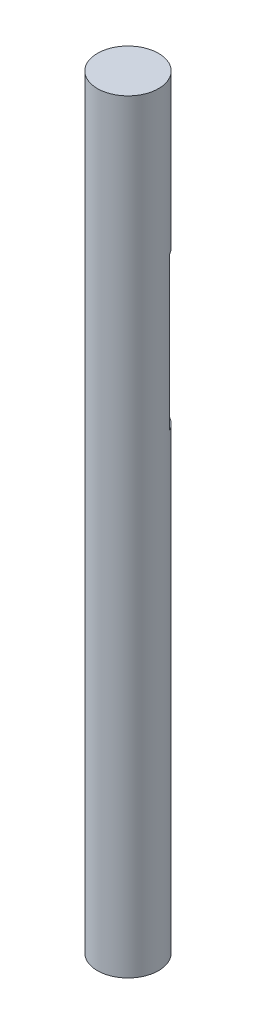
ISO-10303-21;
HEADER;
FILE_DESCRIPTION(('STEP AP214'),'2;1');
FILE_NAME('part.step','',(''),(''),'','','');
FILE_SCHEMA(('AUTOMOTIVE_DESIGN { 1 0 10303 214 1 1 1 1 }'));
ENDSEC;
DATA;
#1=APPLICATION_CONTEXT('core data for automotive mechanical design processes');
#2=APPLICATION_PROTOCOL_DEFINITION('international standard','automotive_design',2000,#1);
#3=PRODUCT_CONTEXT('',#1,'mechanical');
#4=PRODUCT('Part','Part','',(#3));
#5=PRODUCT_RELATED_PRODUCT_CATEGORY('part','',(#4));
#6=PRODUCT_DEFINITION_FORMATION('','',#4);
#7=PRODUCT_DEFINITION_CONTEXT('part definition',#1,'design');
#8=PRODUCT_DEFINITION('design','',#6,#7);
#9=PRODUCT_DEFINITION_SHAPE('','',#8);
#10=(LENGTH_UNIT() NAMED_UNIT(*) SI_UNIT(.MILLI.,.METRE.));
#11=(NAMED_UNIT(*) PLANE_ANGLE_UNIT() SI_UNIT($,.RADIAN.));
#12=(NAMED_UNIT(*) SI_UNIT($,.STERADIAN.) SOLID_ANGLE_UNIT());
#13=UNCERTAINTY_MEASURE_WITH_UNIT(LENGTH_MEASURE(1.E-05),#10,'distance_accuracy_value','');
#14=(GEOMETRIC_REPRESENTATION_CONTEXT(3) GLOBAL_UNCERTAINTY_ASSIGNED_CONTEXT((#13)) GLOBAL_UNIT_ASSIGNED_CONTEXT((#10,
#11,#12)) REPRESENTATION_CONTEXT('',''));
#15=CARTESIAN_POINT('',(0.,0.,0.));
#16=DIRECTION('',(0.,0.,1.));
#17=DIRECTION('',(1.,0.,0.));
#18=AXIS2_PLACEMENT_3D('',#15,#16,#17);
#19=CARTESIAN_POINT('',(0.,100.,0.));
#20=DIRECTION('',(0.,-1.,0.));
#21=DIRECTION('',(0.,0.,-1.));
#22=AXIS2_PLACEMENT_3D('',#19,#20,#21);
#23=CYLINDRICAL_SURFACE('',#22,4.);
#24=DIRECTION('',(0.,1.,0.));
#25=VECTOR('',#24,1.);
#26=CARTESIAN_POINT('',(-3.46410161513775,60.,-2.));
#27=LINE('',#26,#25);
#28=CARTESIAN_POINT('',(-3.46410161513775,60.,-2.));
#29=VERTEX_POINT('',#28);
#30=CARTESIAN_POINT('',(-3.46410161513775,80.,-2.));
#31=VERTEX_POINT('',#30);
#32=EDGE_CURVE('E72',#29,#31,#27,.T.);
#33=ORIENTED_EDGE('',*,*,#32,.F.);
#34=CARTESIAN_POINT('',(0.,60.,0.));
#35=DIRECTION('',(0.,-1.,0.));
#36=DIRECTION('',(0.,0.,-1.));
#37=AXIS2_PLACEMENT_3D('',#34,#35,#36);
#38=CIRCLE('',#37,4.);
#39=CARTESIAN_POINT('',(3.46410161513775,60.,-2.));
#40=VERTEX_POINT('',#39);
#41=EDGE_CURVE('E11',#29,#40,#38,.T.);
#42=ORIENTED_EDGE('',*,*,#41,.T.);
#43=DIRECTION('',(0.,1.,0.));
#44=VECTOR('',#43,1.);
#45=CARTESIAN_POINT('',(3.46410161513775,60.,-2.));
#46=LINE('',#45,#44);
#47=CARTESIAN_POINT('',(3.46410161513775,80.,-2.));
#48=VERTEX_POINT('',#47);
#49=EDGE_CURVE('E60',#40,#48,#46,.T.);
#50=ORIENTED_EDGE('',*,*,#49,.T.);
#51=CARTESIAN_POINT('',(0.,80.,0.));
#52=DIRECTION('',(0.,-1.,0.));
#53=DIRECTION('',(0.,0.,-1.));
#54=AXIS2_PLACEMENT_3D('',#51,#52,#53);
#55=CIRCLE('',#54,4.);
#56=EDGE_CURVE('E46',#31,#48,#55,.T.);
#57=ORIENTED_EDGE('',*,*,#56,.F.);
#58=EDGE_LOOP('',(#33,#42,#50,#57));
#59=FACE_BOUND('',#58,.T.);
#60=CARTESIAN_POINT('',(0.,100.,0.));
#61=DIRECTION('',(0.,1.,0.));
#62=DIRECTION('',(0.,0.,1.));
#63=AXIS2_PLACEMENT_3D('',#60,#61,#62);
#64=CIRCLE('',#63,4.);
#65=CARTESIAN_POINT('',(0.,100.,4.));
#66=VERTEX_POINT('',#65);
#67=EDGE_CURVE('E70',#66,#66,#64,.T.);
#68=ORIENTED_EDGE('',*,*,#67,.F.);
#69=EDGE_LOOP('',(#68));
#70=FACE_BOUND('',#69,.T.);
#71=CARTESIAN_POINT('',(0.,0.,0.));
#72=DIRECTION('',(0.,1.,0.));
#73=DIRECTION('',(0.,0.,1.));
#74=AXIS2_PLACEMENT_3D('',#71,#72,#73);
#75=CIRCLE('',#74,4.);
#76=CARTESIAN_POINT('',(0.,0.,4.));
#77=VERTEX_POINT('',#76);
#78=EDGE_CURVE('E78',#77,#77,#75,.T.);
#79=ORIENTED_EDGE('',*,*,#78,.T.);
#80=EDGE_LOOP('',(#79));
#81=FACE_BOUND('',#80,.T.);
#82=ADVANCED_FACE('F38',(#59,#70,#81),#23,.T.);
#83=CARTESIAN_POINT('',(0.,100.,0.));
#84=DIRECTION('',(0.,1.,0.));
#85=DIRECTION('',(0.,0.,1.));
#86=AXIS2_PLACEMENT_3D('',#83,#84,#85);
#87=PLANE('',#86);
#88=ORIENTED_EDGE('',*,*,#67,.T.);
#89=EDGE_LOOP('',(#88));
#90=FACE_BOUND('',#89,.T.);
#91=ADVANCED_FACE('F91',(#90),#87,.T.);
#92=CARTESIAN_POINT('',(0.,0.,0.));
#93=DIRECTION('',(0.,1.,0.));
#94=DIRECTION('',(0.,0.,1.));
#95=AXIS2_PLACEMENT_3D('',#92,#93,#94);
#96=PLANE('',#95);
#97=ORIENTED_EDGE('',*,*,#78,.F.);
#98=EDGE_LOOP('',(#97));
#99=FACE_BOUND('',#98,.T.);
#100=ADVANCED_FACE('F96',(#99),#96,.F.);
#101=CARTESIAN_POINT('',(0.,60.,0.));
#102=DIRECTION('',(0.,-1.,0.));
#103=DIRECTION('',(0.,0.,-1.));
#104=AXIS2_PLACEMENT_3D('',#101,#102,#103);
#105=PLANE('',#104);
#106=DIRECTION('',(1.,0.,0.));
#107=VECTOR('',#106,1.);
#108=CARTESIAN_POINT('',(-3.46410161513775,60.,-2.));
#109=LINE('',#108,#107);
#110=EDGE_CURVE('E74',#29,#40,#109,.T.);
#111=ORIENTED_EDGE('',*,*,#110,.T.);
#112=ORIENTED_EDGE('',*,*,#41,.F.);
#113=EDGE_LOOP('',(#111,#112));
#114=FACE_BOUND('',#113,.T.);
#115=ADVANCED_FACE('F98',(#114),#105,.F.);
#116=CARTESIAN_POINT('',(0.,80.,0.));
#117=DIRECTION('',(0.,-1.,0.));
#118=DIRECTION('',(0.,0.,-1.));
#119=AXIS2_PLACEMENT_3D('',#116,#117,#118);
#120=PLANE('',#119);
#121=ORIENTED_EDGE('',*,*,#56,.T.);
#122=DIRECTION('',(1.,0.,0.));
#123=VECTOR('',#122,1.);
#124=CARTESIAN_POINT('',(-3.46410161513775,80.,-2.));
#125=LINE('',#124,#123);
#126=EDGE_CURVE('E52',#31,#48,#125,.T.);
#127=ORIENTED_EDGE('',*,*,#126,.F.);
#128=EDGE_LOOP('',(#121,#127));
#129=FACE_BOUND('',#128,.T.);
#130=ADVANCED_FACE('F66',(#129),#120,.T.);
#131=CARTESIAN_POINT('',(-3.46410161513775,60.,-2.));
#132=DIRECTION('',(0.,0.,1.));
#133=DIRECTION('',(1.,0.,0.));
#134=AXIS2_PLACEMENT_3D('',#131,#132,#133);
#135=PLANE('',#134);
#136=ORIENTED_EDGE('',*,*,#126,.T.);
#137=ORIENTED_EDGE('',*,*,#49,.F.);
#138=ORIENTED_EDGE('',*,*,#110,.F.);
#139=ORIENTED_EDGE('',*,*,#32,.T.);
#140=EDGE_LOOP('',(#136,#137,#138,#139));
#141=FACE_BOUND('',#140,.T.);
#142=ADVANCED_FACE('F71',(#141),#135,.F.);
#143=CLOSED_SHELL('',(#82,#91,#100,#115,#130,#142));
#144=MANIFOLD_SOLID_BREP('B2',#143);
#145=ADVANCED_BREP_SHAPE_REPRESENTATION('',(#18,#144),#14);
#146=SHAPE_DEFINITION_REPRESENTATION(#9,#145);
ENDSEC;
END-ISO-10303-21;
